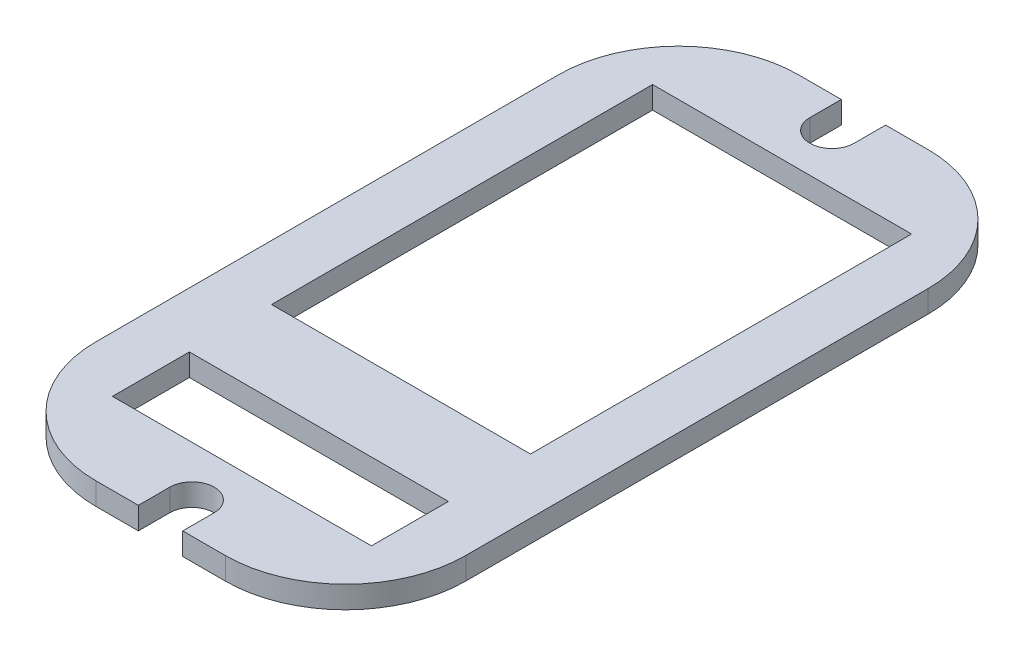
ISO-10303-21;
HEADER;
FILE_DESCRIPTION(('STEP AP214'),'2;1');
FILE_NAME('part.step','',(''),(''),'','','');
FILE_SCHEMA(('AUTOMOTIVE_DESIGN { 1 0 10303 214 1 1 1 1 }'));
ENDSEC;
DATA;
#1=APPLICATION_CONTEXT('core data for automotive mechanical design processes');
#2=APPLICATION_PROTOCOL_DEFINITION('international standard','automotive_design',2000,#1);
#3=PRODUCT_CONTEXT('',#1,'mechanical');
#4=PRODUCT('Part','Part','',(#3));
#5=PRODUCT_RELATED_PRODUCT_CATEGORY('part','',(#4));
#6=PRODUCT_DEFINITION_FORMATION('','',#4);
#7=PRODUCT_DEFINITION_CONTEXT('part definition',#1,'design');
#8=PRODUCT_DEFINITION('design','',#6,#7);
#9=PRODUCT_DEFINITION_SHAPE('','',#8);
#10=(LENGTH_UNIT() NAMED_UNIT(*) SI_UNIT(.MILLI.,.METRE.));
#11=(NAMED_UNIT(*) PLANE_ANGLE_UNIT() SI_UNIT($,.RADIAN.));
#12=(NAMED_UNIT(*) SI_UNIT($,.STERADIAN.) SOLID_ANGLE_UNIT());
#13=UNCERTAINTY_MEASURE_WITH_UNIT(LENGTH_MEASURE(1.E-05),#10,'distance_accuracy_value','');
#14=(GEOMETRIC_REPRESENTATION_CONTEXT(3) GLOBAL_UNCERTAINTY_ASSIGNED_CONTEXT((#13)) GLOBAL_UNIT_ASSIGNED_CONTEXT((#10,
#11,#12)) REPRESENTATION_CONTEXT('',''));
#15=CARTESIAN_POINT('',(0.,0.,0.));
#16=DIRECTION('',(0.,0.,1.));
#17=DIRECTION('',(1.,0.,0.));
#18=AXIS2_PLACEMENT_3D('',#15,#16,#17);
#19=CARTESIAN_POINT('',(0.,0.6,-8.65));
#20=DIRECTION('',(0.,1.,0.));
#21=DIRECTION('',(0.,0.,1.));
#22=AXIS2_PLACEMENT_3D('',#19,#20,#21);
#23=PLANE('',#22);
#24=CARTESIAN_POINT('',(0.,0.6,-8.65));
#25=DIRECTION('',(0.,-1.,0.));
#26=DIRECTION('',(0.,0.,1.));
#27=AXIS2_PLACEMENT_3D('',#24,#25,#26);
#28=CIRCLE('',#27,0.599999999999999);
#29=CARTESIAN_POINT('',(0.599999999999996,0.6,-8.65));
#30=VERTEX_POINT('',#29);
#31=CARTESIAN_POINT('',(-0.600000000000002,0.6,-8.65));
#32=VERTEX_POINT('',#31);
#33=EDGE_CURVE('E281',#30,#32,#28,.T.);
#34=ORIENTED_EDGE('',*,*,#33,.T.);
#35=DIRECTION('',(0.,0.,-1.));
#36=VECTOR('',#35,1.);
#37=CARTESIAN_POINT('',(-0.600000000000005,0.6,-9.5));
#38=LINE('',#37,#36);
#39=CARTESIAN_POINT('',(-0.600000000000005,0.6,-9.5));
#40=VERTEX_POINT('',#39);
#41=EDGE_CURVE('E285',#32,#40,#38,.T.);
#42=ORIENTED_EDGE('',*,*,#41,.T.);
#43=DIRECTION('',(-1.,0.,0.));
#44=VECTOR('',#43,1.);
#45=CARTESIAN_POINT('',(-0.600000000000005,0.6,-9.5));
#46=LINE('',#45,#44);
#47=CARTESIAN_POINT('',(-1.75000000000001,0.6,-9.5));
#48=VERTEX_POINT('',#47);
#49=EDGE_CURVE('E289',#40,#48,#46,.T.);
#50=ORIENTED_EDGE('',*,*,#49,.T.);
#51=CARTESIAN_POINT('',(-1.75000000000001,0.6,-6.25));
#52=DIRECTION('',(0.,1.,0.));
#53=DIRECTION('',(0.,0.,1.));
#54=AXIS2_PLACEMENT_3D('',#51,#52,#53);
#55=CIRCLE('',#54,3.25);
#56=CARTESIAN_POINT('',(-5.,0.6,-6.25));
#57=VERTEX_POINT('',#56);
#58=EDGE_CURVE('E292',#48,#57,#55,.T.);
#59=ORIENTED_EDGE('',*,*,#58,.T.);
#60=DIRECTION('',(0.,0.,1.));
#61=VECTOR('',#60,1.);
#62=CARTESIAN_POINT('',(-5.,0.6,-6.25));
#63=LINE('',#62,#61);
#64=CARTESIAN_POINT('',(-5.,0.6,6.25000000000001));
#65=VERTEX_POINT('',#64);
#66=EDGE_CURVE('E295',#57,#65,#63,.T.);
#67=ORIENTED_EDGE('',*,*,#66,.T.);
#68=CARTESIAN_POINT('',(-1.75000000000001,0.6,6.25000000000001));
#69=DIRECTION('',(0.,1.,0.));
#70=DIRECTION('',(0.,0.,1.));
#71=AXIS2_PLACEMENT_3D('',#68,#69,#70);
#72=CIRCLE('',#71,3.24999999999999);
#73=CARTESIAN_POINT('',(-1.75,0.6,9.5));
#74=VERTEX_POINT('',#73);
#75=EDGE_CURVE('E297',#65,#74,#72,.T.);
#76=ORIENTED_EDGE('',*,*,#75,.T.);
#77=DIRECTION('',(1.,0.,0.));
#78=VECTOR('',#77,1.);
#79=CARTESIAN_POINT('',(-1.75000000000001,0.6,9.5));
#80=LINE('',#79,#78);
#81=CARTESIAN_POINT('',(-0.600000000000005,0.6,9.5));
#82=VERTEX_POINT('',#81);
#83=EDGE_CURVE('E299',#74,#82,#80,.T.);
#84=ORIENTED_EDGE('',*,*,#83,.T.);
#85=DIRECTION('',(0.,0.,-1.));
#86=VECTOR('',#85,1.);
#87=CARTESIAN_POINT('',(-0.599999999999991,0.6,8.65));
#88=LINE('',#87,#86);
#89=CARTESIAN_POINT('',(-0.599999999999991,0.6,8.65));
#90=VERTEX_POINT('',#89);
#91=EDGE_CURVE('E301',#82,#90,#88,.T.);
#92=ORIENTED_EDGE('',*,*,#91,.T.);
#93=CARTESIAN_POINT('',(0.,0.6,8.65));
#94=DIRECTION('',(0.,-1.,0.));
#95=DIRECTION('',(0.,0.,1.));
#96=AXIS2_PLACEMENT_3D('',#93,#94,#95);
#97=CIRCLE('',#96,0.599999999999996);
#98=CARTESIAN_POINT('',(0.599999999999998,0.6,8.65));
#99=VERTEX_POINT('',#98);
#100=EDGE_CURVE('E304',#90,#99,#97,.T.);
#101=ORIENTED_EDGE('',*,*,#100,.T.);
#102=DIRECTION('',(0.,0.,1.));
#103=VECTOR('',#102,1.);
#104=CARTESIAN_POINT('',(0.600000000000001,0.6,8.65));
#105=LINE('',#104,#103);
#106=CARTESIAN_POINT('',(0.599999999999993,0.6,9.5));
#107=VERTEX_POINT('',#106);
#108=EDGE_CURVE('E307',#99,#107,#105,.T.);
#109=ORIENTED_EDGE('',*,*,#108,.T.);
#110=DIRECTION('',(1.,0.,0.));
#111=VECTOR('',#110,1.);
#112=CARTESIAN_POINT('',(0.599999999999993,0.6,9.5));
#113=LINE('',#112,#111);
#114=CARTESIAN_POINT('',(1.75,0.6,9.5));
#115=VERTEX_POINT('',#114);
#116=EDGE_CURVE('E309',#107,#115,#113,.T.);
#117=ORIENTED_EDGE('',*,*,#116,.T.);
#118=CARTESIAN_POINT('',(1.75000000000001,0.6,6.25));
#119=DIRECTION('',(0.,1.,0.));
#120=DIRECTION('',(0.,0.,1.));
#121=AXIS2_PLACEMENT_3D('',#118,#119,#120);
#122=CIRCLE('',#121,3.25);
#123=CARTESIAN_POINT('',(5.,0.6,6.25000000000001));
#124=VERTEX_POINT('',#123);
#125=EDGE_CURVE('E311',#115,#124,#122,.T.);
#126=ORIENTED_EDGE('',*,*,#125,.T.);
#127=DIRECTION('',(0.,0.,-1.));
#128=VECTOR('',#127,1.);
#129=CARTESIAN_POINT('',(5.,0.6,6.25000000000001));
#130=LINE('',#129,#128);
#131=CARTESIAN_POINT('',(5.,0.6,-6.25));
#132=VERTEX_POINT('',#131);
#133=EDGE_CURVE('E314',#124,#132,#130,.T.);
#134=ORIENTED_EDGE('',*,*,#133,.T.);
#135=CARTESIAN_POINT('',(1.75,0.6,-6.25));
#136=DIRECTION('',(0.,1.,0.));
#137=DIRECTION('',(0.,0.,1.));
#138=AXIS2_PLACEMENT_3D('',#135,#136,#137);
#139=CIRCLE('',#138,3.25);
#140=CARTESIAN_POINT('',(1.75,0.6,-9.5));
#141=VERTEX_POINT('',#140);
#142=EDGE_CURVE('E317',#132,#141,#139,.T.);
#143=ORIENTED_EDGE('',*,*,#142,.T.);
#144=DIRECTION('',(-1.,0.,0.));
#145=VECTOR('',#144,1.);
#146=CARTESIAN_POINT('',(1.75,0.6,-9.5));
#147=LINE('',#146,#145);
#148=CARTESIAN_POINT('',(0.599999999999993,0.6,-9.5));
#149=VERTEX_POINT('',#148);
#150=EDGE_CURVE('E319',#141,#149,#147,.T.);
#151=ORIENTED_EDGE('',*,*,#150,.T.);
#152=DIRECTION('',(0.,0.,1.));
#153=VECTOR('',#152,1.);
#154=CARTESIAN_POINT('',(0.599999999999993,0.6,-9.5));
#155=LINE('',#154,#153);
#156=EDGE_CURVE('E321',#149,#30,#155,.T.);
#157=ORIENTED_EDGE('',*,*,#156,.T.);
#158=EDGE_LOOP('',(#34,#42,#50,#59,#67,#76,#84,#92,#101,#109,#117,#126,#134,#143,#151,#157));
#159=FACE_BOUND('',#158,.T.);
#160=DIRECTION('',(1.,0.,0.));
#161=VECTOR('',#160,1.);
#162=CARTESIAN_POINT('',(-3.5,0.6,3.));
#163=LINE('',#162,#161);
#164=CARTESIAN_POINT('',(-3.5,0.6,3.));
#165=VERTEX_POINT('',#164);
#166=CARTESIAN_POINT('',(3.5,0.6,3.));
#167=VERTEX_POINT('',#166);
#168=EDGE_CURVE('E244',#165,#167,#163,.T.);
#169=ORIENTED_EDGE('',*,*,#168,.F.);
#170=DIRECTION('',(0.,0.,1.));
#171=VECTOR('',#170,1.);
#172=CARTESIAN_POINT('',(-3.5,0.6,-7.3));
#173=LINE('',#172,#171);
#174=CARTESIAN_POINT('',(-3.5,0.6,-7.3));
#175=VERTEX_POINT('',#174);
#176=EDGE_CURVE('E241',#175,#165,#173,.T.);
#177=ORIENTED_EDGE('',*,*,#176,.F.);
#178=DIRECTION('',(-1.,0.,0.));
#179=VECTOR('',#178,1.);
#180=CARTESIAN_POINT('',(3.5,0.6,-7.3));
#181=LINE('',#180,#179);
#182=CARTESIAN_POINT('',(3.5,0.6,-7.3));
#183=VERTEX_POINT('',#182);
#184=EDGE_CURVE('E251',#183,#175,#181,.T.);
#185=ORIENTED_EDGE('',*,*,#184,.F.);
#186=DIRECTION('',(0.,0.,-1.));
#187=VECTOR('',#186,1.);
#188=CARTESIAN_POINT('',(3.5,0.6,3.));
#189=LINE('',#188,#187);
#190=EDGE_CURVE('E248',#167,#183,#189,.T.);
#191=ORIENTED_EDGE('',*,*,#190,.F.);
#192=EDGE_LOOP('',(#169,#177,#185,#191));
#193=FACE_BOUND('',#192,.T.);
#194=DIRECTION('',(1.,0.,0.));
#195=VECTOR('',#194,1.);
#196=CARTESIAN_POINT('',(-3.5,0.6,7.3));
#197=LINE('',#196,#195);
#198=CARTESIAN_POINT('',(-3.5,0.6,7.3));
#199=VERTEX_POINT('',#198);
#200=CARTESIAN_POINT('',(3.5,0.6,7.3));
#201=VERTEX_POINT('',#200);
#202=EDGE_CURVE('E205',#199,#201,#197,.T.);
#203=ORIENTED_EDGE('',*,*,#202,.F.);
#204=DIRECTION('',(0.,0.,1.));
#205=VECTOR('',#204,1.);
#206=CARTESIAN_POINT('',(-3.5,0.6,5.22));
#207=LINE('',#206,#205);
#208=CARTESIAN_POINT('',(-3.5,0.6,5.22));
#209=VERTEX_POINT('',#208);
#210=EDGE_CURVE('E196',#209,#199,#207,.T.);
#211=ORIENTED_EDGE('',*,*,#210,.F.);
#212=DIRECTION('',(-1.,0.,0.));
#213=VECTOR('',#212,1.);
#214=CARTESIAN_POINT('',(3.5,0.6,5.22));
#215=LINE('',#214,#213);
#216=CARTESIAN_POINT('',(3.5,0.6,5.22));
#217=VERTEX_POINT('',#216);
#218=EDGE_CURVE('E222',#217,#209,#215,.T.);
#219=ORIENTED_EDGE('',*,*,#218,.F.);
#220=DIRECTION('',(0.,0.,-1.));
#221=VECTOR('',#220,1.);
#222=CARTESIAN_POINT('',(3.5,0.6,7.3));
#223=LINE('',#222,#221);
#224=EDGE_CURVE('E218',#201,#217,#223,.T.);
#225=ORIENTED_EDGE('',*,*,#224,.F.);
#226=EDGE_LOOP('',(#203,#211,#219,#225));
#227=FACE_BOUND('',#226,.T.);
#228=ADVANCED_FACE('F34',(#159,#193,#227),#23,.T.);
#229=CARTESIAN_POINT('',(0.,0.,-8.65));
#230=DIRECTION('',(0.,1.,0.));
#231=DIRECTION('',(0.,0.,1.));
#232=AXIS2_PLACEMENT_3D('',#229,#230,#231);
#233=PLANE('',#232);
#234=DIRECTION('',(0.,0.,1.));
#235=VECTOR('',#234,1.);
#236=CARTESIAN_POINT('',(-3.5,0.,-7.3));
#237=LINE('',#236,#235);
#238=CARTESIAN_POINT('',(-3.5,0.,-7.3));
#239=VERTEX_POINT('',#238);
#240=CARTESIAN_POINT('',(-3.5,0.,3.));
#241=VERTEX_POINT('',#240);
#242=EDGE_CURVE('E214',#239,#241,#237,.T.);
#243=ORIENTED_EDGE('',*,*,#242,.T.);
#244=DIRECTION('',(1.,0.,0.));
#245=VECTOR('',#244,1.);
#246=CARTESIAN_POINT('',(-3.5,0.,3.));
#247=LINE('',#246,#245);
#248=CARTESIAN_POINT('',(3.5,0.,3.));
#249=VERTEX_POINT('',#248);
#250=EDGE_CURVE('E257',#241,#249,#247,.T.);
#251=ORIENTED_EDGE('',*,*,#250,.T.);
#252=DIRECTION('',(0.,0.,-1.));
#253=VECTOR('',#252,1.);
#254=CARTESIAN_POINT('',(3.5,0.,3.));
#255=LINE('',#254,#253);
#256=CARTESIAN_POINT('',(3.5,0.,-7.3));
#257=VERTEX_POINT('',#256);
#258=EDGE_CURVE('E261',#249,#257,#255,.T.);
#259=ORIENTED_EDGE('',*,*,#258,.T.);
#260=DIRECTION('',(-1.,0.,0.));
#261=VECTOR('',#260,1.);
#262=CARTESIAN_POINT('',(3.5,0.,-7.3));
#263=LINE('',#262,#261);
#264=EDGE_CURVE('E245',#257,#239,#263,.T.);
#265=ORIENTED_EDGE('',*,*,#264,.T.);
#266=EDGE_LOOP('',(#243,#251,#259,#265));
#267=FACE_BOUND('',#266,.T.);
#268=CARTESIAN_POINT('',(0.,0.,-8.65));
#269=DIRECTION('',(0.,-1.,0.));
#270=DIRECTION('',(0.,0.,1.));
#271=AXIS2_PLACEMENT_3D('',#268,#269,#270);
#272=CIRCLE('',#271,0.599999999999999);
#273=CARTESIAN_POINT('',(0.599999999999996,0.,-8.65));
#274=VERTEX_POINT('',#273);
#275=CARTESIAN_POINT('',(-0.600000000000002,0.,-8.65));
#276=VERTEX_POINT('',#275);
#277=EDGE_CURVE('E280',#274,#276,#272,.T.);
#278=ORIENTED_EDGE('',*,*,#277,.F.);
#279=DIRECTION('',(0.,0.,1.));
#280=VECTOR('',#279,1.);
#281=CARTESIAN_POINT('',(0.599999999999993,0.,-9.5));
#282=LINE('',#281,#280);
#283=CARTESIAN_POINT('',(0.599999999999993,0.,-9.5));
#284=VERTEX_POINT('',#283);
#285=EDGE_CURVE('E286',#284,#274,#282,.T.);
#286=ORIENTED_EDGE('',*,*,#285,.F.);
#287=DIRECTION('',(-1.,0.,0.));
#288=VECTOR('',#287,1.);
#289=CARTESIAN_POINT('',(1.75,0.,-9.5));
#290=LINE('',#289,#288);
#291=CARTESIAN_POINT('',(1.75,0.,-9.5));
#292=VERTEX_POINT('',#291);
#293=EDGE_CURVE('E365',#292,#284,#290,.T.);
#294=ORIENTED_EDGE('',*,*,#293,.F.);
#295=CARTESIAN_POINT('',(1.75,0.,-6.25));
#296=DIRECTION('',(0.,1.,0.));
#297=DIRECTION('',(0.,0.,1.));
#298=AXIS2_PLACEMENT_3D('',#295,#296,#297);
#299=CIRCLE('',#298,3.25);
#300=CARTESIAN_POINT('',(5.,0.,-6.25));
#301=VERTEX_POINT('',#300);
#302=EDGE_CURVE('E363',#301,#292,#299,.T.);
#303=ORIENTED_EDGE('',*,*,#302,.F.);
#304=DIRECTION('',(0.,0.,-1.));
#305=VECTOR('',#304,1.);
#306=CARTESIAN_POINT('',(5.,0.,6.25000000000001));
#307=LINE('',#306,#305);
#308=CARTESIAN_POINT('',(5.,0.,6.25000000000001));
#309=VERTEX_POINT('',#308);
#310=EDGE_CURVE('E360',#309,#301,#307,.T.);
#311=ORIENTED_EDGE('',*,*,#310,.F.);
#312=CARTESIAN_POINT('',(1.75000000000001,0.,6.25));
#313=DIRECTION('',(0.,1.,0.));
#314=DIRECTION('',(0.,0.,1.));
#315=AXIS2_PLACEMENT_3D('',#312,#313,#314);
#316=CIRCLE('',#315,3.25);
#317=CARTESIAN_POINT('',(1.75,0.,9.5));
#318=VERTEX_POINT('',#317);
#319=EDGE_CURVE('E357',#318,#309,#316,.T.);
#320=ORIENTED_EDGE('',*,*,#319,.F.);
#321=DIRECTION('',(1.,0.,0.));
#322=VECTOR('',#321,1.);
#323=CARTESIAN_POINT('',(0.599999999999993,0.,9.5));
#324=LINE('',#323,#322);
#325=CARTESIAN_POINT('',(0.599999999999993,0.,9.5));
#326=VERTEX_POINT('',#325);
#327=EDGE_CURVE('E354',#326,#318,#324,.T.);
#328=ORIENTED_EDGE('',*,*,#327,.F.);
#329=DIRECTION('',(0.,0.,1.));
#330=VECTOR('',#329,1.);
#331=CARTESIAN_POINT('',(0.600000000000001,0.,8.65));
#332=LINE('',#331,#330);
#333=CARTESIAN_POINT('',(0.599999999999998,0.,8.65));
#334=VERTEX_POINT('',#333);
#335=EDGE_CURVE('E351',#334,#326,#332,.T.);
#336=ORIENTED_EDGE('',*,*,#335,.F.);
#337=CARTESIAN_POINT('',(0.,0.,8.65));
#338=DIRECTION('',(0.,-1.,0.));
#339=DIRECTION('',(0.,0.,1.));
#340=AXIS2_PLACEMENT_3D('',#337,#338,#339);
#341=CIRCLE('',#340,0.599999999999996);
#342=CARTESIAN_POINT('',(-0.599999999999991,0.,8.65));
#343=VERTEX_POINT('',#342);
#344=EDGE_CURVE('E348',#343,#334,#341,.T.);
#345=ORIENTED_EDGE('',*,*,#344,.F.);
#346=DIRECTION('',(0.,0.,-1.));
#347=VECTOR('',#346,1.);
#348=CARTESIAN_POINT('',(-0.599999999999991,0.,8.65));
#349=LINE('',#348,#347);
#350=CARTESIAN_POINT('',(-0.600000000000005,0.,9.5));
#351=VERTEX_POINT('',#350);
#352=EDGE_CURVE('E345',#351,#343,#349,.T.);
#353=ORIENTED_EDGE('',*,*,#352,.F.);
#354=DIRECTION('',(1.,0.,0.));
#355=VECTOR('',#354,1.);
#356=CARTESIAN_POINT('',(-1.75000000000001,0.,9.5));
#357=LINE('',#356,#355);
#358=CARTESIAN_POINT('',(-1.75,0.,9.5));
#359=VERTEX_POINT('',#358);
#360=EDGE_CURVE('E342',#359,#351,#357,.T.);
#361=ORIENTED_EDGE('',*,*,#360,.F.);
#362=CARTESIAN_POINT('',(-1.75000000000001,0.,6.25000000000001));
#363=DIRECTION('',(0.,1.,0.));
#364=DIRECTION('',(0.,0.,1.));
#365=AXIS2_PLACEMENT_3D('',#362,#363,#364);
#366=CIRCLE('',#365,3.24999999999999);
#367=CARTESIAN_POINT('',(-5.,0.,6.25000000000001));
#368=VERTEX_POINT('',#367);
#369=EDGE_CURVE('E339',#368,#359,#366,.T.);
#370=ORIENTED_EDGE('',*,*,#369,.F.);
#371=DIRECTION('',(0.,0.,1.));
#372=VECTOR('',#371,1.);
#373=CARTESIAN_POINT('',(-5.,0.,-6.25));
#374=LINE('',#373,#372);
#375=CARTESIAN_POINT('',(-5.,0.,-6.25));
#376=VERTEX_POINT('',#375);
#377=EDGE_CURVE('E336',#376,#368,#374,.T.);
#378=ORIENTED_EDGE('',*,*,#377,.F.);
#379=CARTESIAN_POINT('',(-1.75000000000001,0.,-6.25));
#380=DIRECTION('',(0.,1.,0.));
#381=DIRECTION('',(0.,0.,1.));
#382=AXIS2_PLACEMENT_3D('',#379,#380,#381);
#383=CIRCLE('',#382,3.25);
#384=CARTESIAN_POINT('',(-1.75000000000001,0.,-9.5));
#385=VERTEX_POINT('',#384);
#386=EDGE_CURVE('E333',#385,#376,#383,.T.);
#387=ORIENTED_EDGE('',*,*,#386,.F.);
#388=DIRECTION('',(-1.,0.,0.));
#389=VECTOR('',#388,1.);
#390=CARTESIAN_POINT('',(-0.600000000000005,0.,-9.5));
#391=LINE('',#390,#389);
#392=CARTESIAN_POINT('',(-0.600000000000005,0.,-9.5));
#393=VERTEX_POINT('',#392);
#394=EDGE_CURVE('E330',#393,#385,#391,.T.);
#395=ORIENTED_EDGE('',*,*,#394,.F.);
#396=DIRECTION('',(0.,0.,-1.));
#397=VECTOR('',#396,1.);
#398=CARTESIAN_POINT('',(-0.600000000000005,0.,-9.5));
#399=LINE('',#398,#397);
#400=EDGE_CURVE('E327',#276,#393,#399,.T.);
#401=ORIENTED_EDGE('',*,*,#400,.F.);
#402=EDGE_LOOP('',(#278,#286,#294,#303,#311,#320,#328,#336,#345,#353,#361,#370,#378,#387,#395,#401));
#403=FACE_BOUND('',#402,.T.);
#404=DIRECTION('',(0.,0.,1.));
#405=VECTOR('',#404,1.);
#406=CARTESIAN_POINT('',(-3.5,0.,5.22));
#407=LINE('',#406,#405);
#408=CARTESIAN_POINT('',(-3.5,0.,5.22));
#409=VERTEX_POINT('',#408);
#410=CARTESIAN_POINT('',(-3.5,0.,7.3));
#411=VERTEX_POINT('',#410);
#412=EDGE_CURVE('E58',#409,#411,#407,.T.);
#413=ORIENTED_EDGE('',*,*,#412,.T.);
#414=DIRECTION('',(1.,0.,0.));
#415=VECTOR('',#414,1.);
#416=CARTESIAN_POINT('',(-3.5,0.,7.3));
#417=LINE('',#416,#415);
#418=CARTESIAN_POINT('',(3.5,0.,7.3));
#419=VERTEX_POINT('',#418);
#420=EDGE_CURVE('E212',#411,#419,#417,.T.);
#421=ORIENTED_EDGE('',*,*,#420,.T.);
#422=DIRECTION('',(0.,0.,-1.));
#423=VECTOR('',#422,1.);
#424=CARTESIAN_POINT('',(3.5,0.,7.3));
#425=LINE('',#424,#423);
#426=CARTESIAN_POINT('',(3.5,0.,5.22));
#427=VERTEX_POINT('',#426);
#428=EDGE_CURVE('E230',#419,#427,#425,.T.);
#429=ORIENTED_EDGE('',*,*,#428,.T.);
#430=DIRECTION('',(-1.,0.,0.));
#431=VECTOR('',#430,1.);
#432=CARTESIAN_POINT('',(3.5,0.,5.22));
#433=LINE('',#432,#431);
#434=EDGE_CURVE('E206',#427,#409,#433,.T.);
#435=ORIENTED_EDGE('',*,*,#434,.T.);
#436=EDGE_LOOP('',(#413,#421,#429,#435));
#437=FACE_BOUND('',#436,.T.);
#438=ADVANCED_FACE('F427',(#267,#403,#437),#233,.F.);
#439=CARTESIAN_POINT('',(0.,0.6,-8.65));
#440=DIRECTION('',(0.,-1.,0.));
#441=DIRECTION('',(0.,0.,-1.));
#442=AXIS2_PLACEMENT_3D('',#439,#440,#441);
#443=CYLINDRICAL_SURFACE('',#442,0.599999999999999);
#444=ORIENTED_EDGE('',*,*,#277,.T.);
#445=DIRECTION('',(0.,-1.,0.));
#446=VECTOR('',#445,1.);
#447=CARTESIAN_POINT('',(-0.600000000000002,0.6,-8.65));
#448=LINE('',#447,#446);
#449=EDGE_CURVE('E11',#32,#276,#448,.T.);
#450=ORIENTED_EDGE('',*,*,#449,.F.);
#451=ORIENTED_EDGE('',*,*,#33,.F.);
#452=DIRECTION('',(0.,-1.,0.));
#453=VECTOR('',#452,1.);
#454=CARTESIAN_POINT('',(0.599999999999996,0.6,-8.65));
#455=LINE('',#454,#453);
#456=EDGE_CURVE('E323',#30,#274,#455,.T.);
#457=ORIENTED_EDGE('',*,*,#456,.T.);
#458=EDGE_LOOP('',(#444,#450,#451,#457));
#459=FACE_BOUND('',#458,.T.);
#460=ADVANCED_FACE('F36',(#459),#443,.F.);
#461=CARTESIAN_POINT('',(-0.600000000000005,0.6,-9.5));
#462=DIRECTION('',(-1.,0.,0.));
#463=DIRECTION('',(0.,0.,1.));
#464=AXIS2_PLACEMENT_3D('',#461,#462,#463);
#465=PLANE('',#464);
#466=ORIENTED_EDGE('',*,*,#400,.T.);
#467=DIRECTION('',(0.,-1.,0.));
#468=VECTOR('',#467,1.);
#469=CARTESIAN_POINT('',(-0.600000000000005,0.6,-9.5));
#470=LINE('',#469,#468);
#471=EDGE_CURVE('E43',#40,#393,#470,.T.);
#472=ORIENTED_EDGE('',*,*,#471,.F.);
#473=ORIENTED_EDGE('',*,*,#41,.F.);
#474=ORIENTED_EDGE('',*,*,#449,.T.);
#475=EDGE_LOOP('',(#466,#472,#473,#474));
#476=FACE_BOUND('',#475,.T.);
#477=ADVANCED_FACE('F445',(#476),#465,.F.);
#478=CARTESIAN_POINT('',(-0.600000000000005,0.6,-9.5));
#479=DIRECTION('',(0.,0.,1.));
#480=DIRECTION('',(1.,0.,0.));
#481=AXIS2_PLACEMENT_3D('',#478,#479,#480);
#482=PLANE('',#481);
#483=ORIENTED_EDGE('',*,*,#394,.T.);
#484=DIRECTION('',(0.,-1.,0.));
#485=VECTOR('',#484,1.);
#486=CARTESIAN_POINT('',(-1.75000000000001,0.6,-9.5));
#487=LINE('',#486,#485);
#488=EDGE_CURVE('E412',#48,#385,#487,.T.);
#489=ORIENTED_EDGE('',*,*,#488,.F.);
#490=ORIENTED_EDGE('',*,*,#49,.F.);
#491=ORIENTED_EDGE('',*,*,#471,.T.);
#492=EDGE_LOOP('',(#483,#489,#490,#491));
#493=FACE_BOUND('',#492,.T.);
#494=ADVANCED_FACE('F421',(#493),#482,.F.);
#495=CARTESIAN_POINT('',(-1.75000000000001,0.6,-6.25));
#496=DIRECTION('',(0.,-1.,0.));
#497=DIRECTION('',(0.,0.,-1.));
#498=AXIS2_PLACEMENT_3D('',#495,#496,#497);
#499=CYLINDRICAL_SURFACE('',#498,3.25);
#500=ORIENTED_EDGE('',*,*,#386,.T.);
#501=DIRECTION('',(0.,-1.,0.));
#502=VECTOR('',#501,1.);
#503=CARTESIAN_POINT('',(-5.,0.6,-6.25));
#504=LINE('',#503,#502);
#505=EDGE_CURVE('E409',#57,#376,#504,.T.);
#506=ORIENTED_EDGE('',*,*,#505,.F.);
#507=ORIENTED_EDGE('',*,*,#58,.F.);
#508=ORIENTED_EDGE('',*,*,#488,.T.);
#509=EDGE_LOOP('',(#500,#506,#507,#508));
#510=FACE_BOUND('',#509,.T.);
#511=ADVANCED_FACE('F433',(#510),#499,.T.);
#512=CARTESIAN_POINT('',(-5.,0.6,-6.25));
#513=DIRECTION('',(1.,0.,0.));
#514=DIRECTION('',(0.,0.,-1.));
#515=AXIS2_PLACEMENT_3D('',#512,#513,#514);
#516=PLANE('',#515);
#517=ORIENTED_EDGE('',*,*,#377,.T.);
#518=DIRECTION('',(0.,-1.,0.));
#519=VECTOR('',#518,1.);
#520=CARTESIAN_POINT('',(-5.,0.6,6.25000000000001));
#521=LINE('',#520,#519);
#522=EDGE_CURVE('E406',#65,#368,#521,.T.);
#523=ORIENTED_EDGE('',*,*,#522,.F.);
#524=ORIENTED_EDGE('',*,*,#66,.F.);
#525=ORIENTED_EDGE('',*,*,#505,.T.);
#526=EDGE_LOOP('',(#517,#523,#524,#525));
#527=FACE_BOUND('',#526,.T.);
#528=ADVANCED_FACE('F437',(#527),#516,.F.);
#529=CARTESIAN_POINT('',(-1.75000000000001,0.6,6.25000000000001));
#530=DIRECTION('',(0.,-1.,0.));
#531=DIRECTION('',(0.,0.,-1.));
#532=AXIS2_PLACEMENT_3D('',#529,#530,#531);
#533=CYLINDRICAL_SURFACE('',#532,3.24999999999999);
#534=ORIENTED_EDGE('',*,*,#369,.T.);
#535=DIRECTION('',(0.,-1.,0.));
#536=VECTOR('',#535,1.);
#537=CARTESIAN_POINT('',(-1.75,0.6,9.5));
#538=LINE('',#537,#536);
#539=EDGE_CURVE('E403',#74,#359,#538,.T.);
#540=ORIENTED_EDGE('',*,*,#539,.F.);
#541=ORIENTED_EDGE('',*,*,#75,.F.);
#542=ORIENTED_EDGE('',*,*,#522,.T.);
#543=EDGE_LOOP('',(#534,#540,#541,#542));
#544=FACE_BOUND('',#543,.T.);
#545=ADVANCED_FACE('F498',(#544),#533,.T.);
#546=CARTESIAN_POINT('',(-1.75000000000001,0.6,9.5));
#547=DIRECTION('',(0.,0.,-1.));
#548=DIRECTION('',(-1.,0.,0.));
#549=AXIS2_PLACEMENT_3D('',#546,#547,#548);
#550=PLANE('',#549);
#551=ORIENTED_EDGE('',*,*,#360,.T.);
#552=DIRECTION('',(0.,-1.,0.));
#553=VECTOR('',#552,1.);
#554=CARTESIAN_POINT('',(-0.600000000000005,0.6,9.5));
#555=LINE('',#554,#553);
#556=EDGE_CURVE('E399',#82,#351,#555,.T.);
#557=ORIENTED_EDGE('',*,*,#556,.F.);
#558=ORIENTED_EDGE('',*,*,#83,.F.);
#559=ORIENTED_EDGE('',*,*,#539,.T.);
#560=EDGE_LOOP('',(#551,#557,#558,#559));
#561=FACE_BOUND('',#560,.T.);
#562=ADVANCED_FACE('F495',(#561),#550,.F.);
#563=CARTESIAN_POINT('',(-0.599999999999991,0.6,8.65));
#564=DIRECTION('',(-1.,0.,0.));
#565=DIRECTION('',(0.,0.,1.));
#566=AXIS2_PLACEMENT_3D('',#563,#564,#565);
#567=PLANE('',#566);
#568=ORIENTED_EDGE('',*,*,#352,.T.);
#569=DIRECTION('',(0.,-1.,0.));
#570=VECTOR('',#569,1.);
#571=CARTESIAN_POINT('',(-0.599999999999991,0.6,8.65));
#572=LINE('',#571,#570);
#573=EDGE_CURVE('E395',#90,#343,#572,.T.);
#574=ORIENTED_EDGE('',*,*,#573,.F.);
#575=ORIENTED_EDGE('',*,*,#91,.F.);
#576=ORIENTED_EDGE('',*,*,#556,.T.);
#577=EDGE_LOOP('',(#568,#574,#575,#576));
#578=FACE_BOUND('',#577,.T.);
#579=ADVANCED_FACE('F491',(#578),#567,.F.);
#580=CARTESIAN_POINT('',(0.,0.6,8.65));
#581=DIRECTION('',(0.,-1.,0.));
#582=DIRECTION('',(0.,0.,-1.));
#583=AXIS2_PLACEMENT_3D('',#580,#581,#582);
#584=CYLINDRICAL_SURFACE('',#583,0.599999999999996);
#585=ORIENTED_EDGE('',*,*,#344,.T.);
#586=DIRECTION('',(0.,-1.,0.));
#587=VECTOR('',#586,1.);
#588=CARTESIAN_POINT('',(0.599999999999998,0.6,8.65));
#589=LINE('',#588,#587);
#590=EDGE_CURVE('E392',#99,#334,#589,.T.);
#591=ORIENTED_EDGE('',*,*,#590,.F.);
#592=ORIENTED_EDGE('',*,*,#100,.F.);
#593=ORIENTED_EDGE('',*,*,#573,.T.);
#594=EDGE_LOOP('',(#585,#591,#592,#593));
#595=FACE_BOUND('',#594,.T.);
#596=ADVANCED_FACE('F487',(#595),#584,.F.);
#597=CARTESIAN_POINT('',(0.600000000000001,0.6,8.65));
#598=DIRECTION('',(1.,0.,0.));
#599=DIRECTION('',(0.,0.,-1.));
#600=AXIS2_PLACEMENT_3D('',#597,#598,#599);
#601=PLANE('',#600);
#602=ORIENTED_EDGE('',*,*,#335,.T.);
#603=DIRECTION('',(0.,-1.,0.));
#604=VECTOR('',#603,1.);
#605=CARTESIAN_POINT('',(0.599999999999993,0.6,9.5));
#606=LINE('',#605,#604);
#607=EDGE_CURVE('E389',#107,#326,#606,.T.);
#608=ORIENTED_EDGE('',*,*,#607,.F.);
#609=ORIENTED_EDGE('',*,*,#108,.F.);
#610=ORIENTED_EDGE('',*,*,#590,.T.);
#611=EDGE_LOOP('',(#602,#608,#609,#610));
#612=FACE_BOUND('',#611,.T.);
#613=ADVANCED_FACE('F482',(#612),#601,.F.);
#614=CARTESIAN_POINT('',(0.599999999999993,0.6,9.5));
#615=DIRECTION('',(0.,0.,-1.));
#616=DIRECTION('',(-1.,0.,0.));
#617=AXIS2_PLACEMENT_3D('',#614,#615,#616);
#618=PLANE('',#617);
#619=ORIENTED_EDGE('',*,*,#327,.T.);
#620=DIRECTION('',(0.,-1.,0.));
#621=VECTOR('',#620,1.);
#622=CARTESIAN_POINT('',(1.75,0.6,9.5));
#623=LINE('',#622,#621);
#624=EDGE_CURVE('E386',#115,#318,#623,.T.);
#625=ORIENTED_EDGE('',*,*,#624,.F.);
#626=ORIENTED_EDGE('',*,*,#116,.F.);
#627=ORIENTED_EDGE('',*,*,#607,.T.);
#628=EDGE_LOOP('',(#619,#625,#626,#627));
#629=FACE_BOUND('',#628,.T.);
#630=ADVANCED_FACE('F476',(#629),#618,.F.);
#631=CARTESIAN_POINT('',(1.75000000000001,0.6,6.25));
#632=DIRECTION('',(0.,-1.,0.));
#633=DIRECTION('',(0.,0.,-1.));
#634=AXIS2_PLACEMENT_3D('',#631,#632,#633);
#635=CYLINDRICAL_SURFACE('',#634,3.25);
#636=ORIENTED_EDGE('',*,*,#319,.T.);
#637=DIRECTION('',(0.,-1.,0.));
#638=VECTOR('',#637,1.);
#639=CARTESIAN_POINT('',(5.,0.6,6.25000000000001));
#640=LINE('',#639,#638);
#641=EDGE_CURVE('E382',#124,#309,#640,.T.);
#642=ORIENTED_EDGE('',*,*,#641,.F.);
#643=ORIENTED_EDGE('',*,*,#125,.F.);
#644=ORIENTED_EDGE('',*,*,#624,.T.);
#645=EDGE_LOOP('',(#636,#642,#643,#644));
#646=FACE_BOUND('',#645,.T.);
#647=ADVANCED_FACE('F472',(#646),#635,.T.);
#648=CARTESIAN_POINT('',(5.,0.6,6.25000000000001));
#649=DIRECTION('',(-1.,0.,0.));
#650=DIRECTION('',(0.,0.,1.));
#651=AXIS2_PLACEMENT_3D('',#648,#649,#650);
#652=PLANE('',#651);
#653=ORIENTED_EDGE('',*,*,#310,.T.);
#654=DIRECTION('',(0.,-1.,0.));
#655=VECTOR('',#654,1.);
#656=CARTESIAN_POINT('',(5.,0.6,-6.25));
#657=LINE('',#656,#655);
#658=EDGE_CURVE('E378',#132,#301,#657,.T.);
#659=ORIENTED_EDGE('',*,*,#658,.F.);
#660=ORIENTED_EDGE('',*,*,#133,.F.);
#661=ORIENTED_EDGE('',*,*,#641,.T.);
#662=EDGE_LOOP('',(#653,#659,#660,#661));
#663=FACE_BOUND('',#662,.T.);
#664=ADVANCED_FACE('F467',(#663),#652,.F.);
#665=CARTESIAN_POINT('',(1.75,0.6,-6.25));
#666=DIRECTION('',(0.,-1.,0.));
#667=DIRECTION('',(0.,0.,-1.));
#668=AXIS2_PLACEMENT_3D('',#665,#666,#667);
#669=CYLINDRICAL_SURFACE('',#668,3.25);
#670=ORIENTED_EDGE('',*,*,#302,.T.);
#671=DIRECTION('',(0.,-1.,0.));
#672=VECTOR('',#671,1.);
#673=CARTESIAN_POINT('',(1.75,0.6,-9.5));
#674=LINE('',#673,#672);
#675=EDGE_CURVE('E375',#141,#292,#674,.T.);
#676=ORIENTED_EDGE('',*,*,#675,.F.);
#677=ORIENTED_EDGE('',*,*,#142,.F.);
#678=ORIENTED_EDGE('',*,*,#658,.T.);
#679=EDGE_LOOP('',(#670,#676,#677,#678));
#680=FACE_BOUND('',#679,.T.);
#681=ADVANCED_FACE('F461',(#680),#669,.T.);
#682=CARTESIAN_POINT('',(1.75,0.6,-9.5));
#683=DIRECTION('',(0.,0.,1.));
#684=DIRECTION('',(1.,0.,0.));
#685=AXIS2_PLACEMENT_3D('',#682,#683,#684);
#686=PLANE('',#685);
#687=ORIENTED_EDGE('',*,*,#293,.T.);
#688=DIRECTION('',(0.,-1.,0.));
#689=VECTOR('',#688,1.);
#690=CARTESIAN_POINT('',(0.599999999999993,0.6,-9.5));
#691=LINE('',#690,#689);
#692=EDGE_CURVE('E371',#149,#284,#691,.T.);
#693=ORIENTED_EDGE('',*,*,#692,.F.);
#694=ORIENTED_EDGE('',*,*,#150,.F.);
#695=ORIENTED_EDGE('',*,*,#675,.T.);
#696=EDGE_LOOP('',(#687,#693,#694,#695));
#697=FACE_BOUND('',#696,.T.);
#698=ADVANCED_FACE('F457',(#697),#686,.F.);
#699=CARTESIAN_POINT('',(0.599999999999993,0.6,-9.5));
#700=DIRECTION('',(1.,0.,0.));
#701=DIRECTION('',(0.,0.,-1.));
#702=AXIS2_PLACEMENT_3D('',#699,#700,#701);
#703=PLANE('',#702);
#704=ORIENTED_EDGE('',*,*,#285,.T.);
#705=ORIENTED_EDGE('',*,*,#456,.F.);
#706=ORIENTED_EDGE('',*,*,#156,.F.);
#707=ORIENTED_EDGE('',*,*,#692,.T.);
#708=EDGE_LOOP('',(#704,#705,#706,#707));
#709=FACE_BOUND('',#708,.T.);
#710=ADVANCED_FACE('F452',(#709),#703,.F.);
#711=CARTESIAN_POINT('',(-3.5,0.6,-7.3));
#712=DIRECTION('',(1.,0.,0.));
#713=DIRECTION('',(0.,0.,-1.));
#714=AXIS2_PLACEMENT_3D('',#711,#712,#713);
#715=PLANE('',#714);
#716=ORIENTED_EDGE('',*,*,#242,.F.);
#717=DIRECTION('',(0.,-1.,0.));
#718=VECTOR('',#717,1.);
#719=CARTESIAN_POINT('',(-3.5,0.6,-7.3));
#720=LINE('',#719,#718);
#721=EDGE_CURVE('E253',#175,#239,#720,.T.);
#722=ORIENTED_EDGE('',*,*,#721,.F.);
#723=ORIENTED_EDGE('',*,*,#176,.T.);
#724=DIRECTION('',(0.,-1.,0.));
#725=VECTOR('',#724,1.);
#726=CARTESIAN_POINT('',(-3.5,0.6,3.));
#727=LINE('',#726,#725);
#728=EDGE_CURVE('E276',#165,#241,#727,.T.);
#729=ORIENTED_EDGE('',*,*,#728,.T.);
#730=EDGE_LOOP('',(#716,#722,#723,#729));
#731=FACE_BOUND('',#730,.T.);
#732=ADVANCED_FACE('F515',(#731),#715,.T.);
#733=CARTESIAN_POINT('',(-3.5,0.6,3.));
#734=DIRECTION('',(0.,0.,-1.));
#735=DIRECTION('',(-1.,0.,0.));
#736=AXIS2_PLACEMENT_3D('',#733,#734,#735);
#737=PLANE('',#736);
#738=ORIENTED_EDGE('',*,*,#250,.F.);
#739=ORIENTED_EDGE('',*,*,#728,.F.);
#740=ORIENTED_EDGE('',*,*,#168,.T.);
#741=DIRECTION('',(0.,-1.,0.));
#742=VECTOR('',#741,1.);
#743=CARTESIAN_POINT('',(3.5,0.6,3.));
#744=LINE('',#743,#742);
#745=EDGE_CURVE('E273',#167,#249,#744,.T.);
#746=ORIENTED_EDGE('',*,*,#745,.T.);
#747=EDGE_LOOP('',(#738,#739,#740,#746));
#748=FACE_BOUND('',#747,.T.);
#749=ADVANCED_FACE('F577',(#748),#737,.T.);
#750=CARTESIAN_POINT('',(3.5,0.6,3.));
#751=DIRECTION('',(-1.,0.,0.));
#752=DIRECTION('',(0.,0.,1.));
#753=AXIS2_PLACEMENT_3D('',#750,#751,#752);
#754=PLANE('',#753);
#755=ORIENTED_EDGE('',*,*,#258,.F.);
#756=ORIENTED_EDGE('',*,*,#745,.F.);
#757=ORIENTED_EDGE('',*,*,#190,.T.);
#758=DIRECTION('',(0.,-1.,0.));
#759=VECTOR('',#758,1.);
#760=CARTESIAN_POINT('',(3.5,0.6,-7.3));
#761=LINE('',#760,#759);
#762=EDGE_CURVE('E271',#183,#257,#761,.T.);
#763=ORIENTED_EDGE('',*,*,#762,.T.);
#764=EDGE_LOOP('',(#755,#756,#757,#763));
#765=FACE_BOUND('',#764,.T.);
#766=ADVANCED_FACE('F584',(#765),#754,.T.);
#767=CARTESIAN_POINT('',(3.5,0.6,-7.3));
#768=DIRECTION('',(0.,0.,1.));
#769=DIRECTION('',(1.,0.,0.));
#770=AXIS2_PLACEMENT_3D('',#767,#768,#769);
#771=PLANE('',#770);
#772=ORIENTED_EDGE('',*,*,#264,.F.);
#773=ORIENTED_EDGE('',*,*,#762,.F.);
#774=ORIENTED_EDGE('',*,*,#184,.T.);
#775=ORIENTED_EDGE('',*,*,#721,.T.);
#776=EDGE_LOOP('',(#772,#773,#774,#775));
#777=FACE_BOUND('',#776,.T.);
#778=ADVANCED_FACE('F591',(#777),#771,.T.);
#779=CARTESIAN_POINT('',(-3.5,0.6,5.22));
#780=DIRECTION('',(1.,0.,0.));
#781=DIRECTION('',(0.,0.,-1.));
#782=AXIS2_PLACEMENT_3D('',#779,#780,#781);
#783=PLANE('',#782);
#784=ORIENTED_EDGE('',*,*,#412,.F.);
#785=DIRECTION('',(0.,-1.,0.));
#786=VECTOR('',#785,1.);
#787=CARTESIAN_POINT('',(-3.5,0.6,5.22));
#788=LINE('',#787,#786);
#789=EDGE_CURVE('E200',#209,#409,#788,.T.);
#790=ORIENTED_EDGE('',*,*,#789,.F.);
#791=ORIENTED_EDGE('',*,*,#210,.T.);
#792=DIRECTION('',(0.,-1.,0.));
#793=VECTOR('',#792,1.);
#794=CARTESIAN_POINT('',(-3.5,0.6,7.3));
#795=LINE('',#794,#793);
#796=EDGE_CURVE('E199',#199,#411,#795,.T.);
#797=ORIENTED_EDGE('',*,*,#796,.T.);
#798=EDGE_LOOP('',(#784,#790,#791,#797));
#799=FACE_BOUND('',#798,.T.);
#800=ADVANCED_FACE('F198',(#799),#783,.T.);
#801=CARTESIAN_POINT('',(-3.5,0.6,7.3));
#802=DIRECTION('',(0.,0.,-1.));
#803=DIRECTION('',(-1.,0.,0.));
#804=AXIS2_PLACEMENT_3D('',#801,#802,#803);
#805=PLANE('',#804);
#806=ORIENTED_EDGE('',*,*,#420,.F.);
#807=ORIENTED_EDGE('',*,*,#796,.F.);
#808=ORIENTED_EDGE('',*,*,#202,.T.);
#809=DIRECTION('',(0.,-1.,0.));
#810=VECTOR('',#809,1.);
#811=CARTESIAN_POINT('',(3.5,0.6,7.3));
#812=LINE('',#811,#810);
#813=EDGE_CURVE('E215',#201,#419,#812,.T.);
#814=ORIENTED_EDGE('',*,*,#813,.T.);
#815=EDGE_LOOP('',(#806,#807,#808,#814));
#816=FACE_BOUND('',#815,.T.);
#817=ADVANCED_FACE('F209',(#816),#805,.T.);
#818=CARTESIAN_POINT('',(3.5,0.6,7.3));
#819=DIRECTION('',(-1.,0.,0.));
#820=DIRECTION('',(0.,0.,1.));
#821=AXIS2_PLACEMENT_3D('',#818,#819,#820);
#822=PLANE('',#821);
#823=ORIENTED_EDGE('',*,*,#428,.F.);
#824=ORIENTED_EDGE('',*,*,#813,.F.);
#825=ORIENTED_EDGE('',*,*,#224,.T.);
#826=DIRECTION('',(0.,-1.,0.));
#827=VECTOR('',#826,1.);
#828=CARTESIAN_POINT('',(3.5,0.6,5.22));
#829=LINE('',#828,#827);
#830=EDGE_CURVE('E50',#217,#427,#829,.T.);
#831=ORIENTED_EDGE('',*,*,#830,.T.);
#832=EDGE_LOOP('',(#823,#824,#825,#831));
#833=FACE_BOUND('',#832,.T.);
#834=ADVANCED_FACE('F612',(#833),#822,.T.);
#835=CARTESIAN_POINT('',(3.5,0.6,5.22));
#836=DIRECTION('',(0.,0.,1.));
#837=DIRECTION('',(1.,0.,0.));
#838=AXIS2_PLACEMENT_3D('',#835,#836,#837);
#839=PLANE('',#838);
#840=ORIENTED_EDGE('',*,*,#434,.F.);
#841=ORIENTED_EDGE('',*,*,#830,.F.);
#842=ORIENTED_EDGE('',*,*,#218,.T.);
#843=ORIENTED_EDGE('',*,*,#789,.T.);
#844=EDGE_LOOP('',(#840,#841,#842,#843));
#845=FACE_BOUND('',#844,.T.);
#846=ADVANCED_FACE('F619',(#845),#839,.T.);
#847=CLOSED_SHELL('',(#228,#438,#460,#477,#494,#511,#528,#545,#562,#579,#596,#613,#630,#647,
#664,#681,#698,#710,#732,#749,#766,#778,#800,#817,#834,#846));
#848=MANIFOLD_SOLID_BREP('B2',#847);
#849=ADVANCED_BREP_SHAPE_REPRESENTATION('',(#18,#848),#14);
#850=SHAPE_DEFINITION_REPRESENTATION(#9,#849);
ENDSEC;
END-ISO-10303-21;
